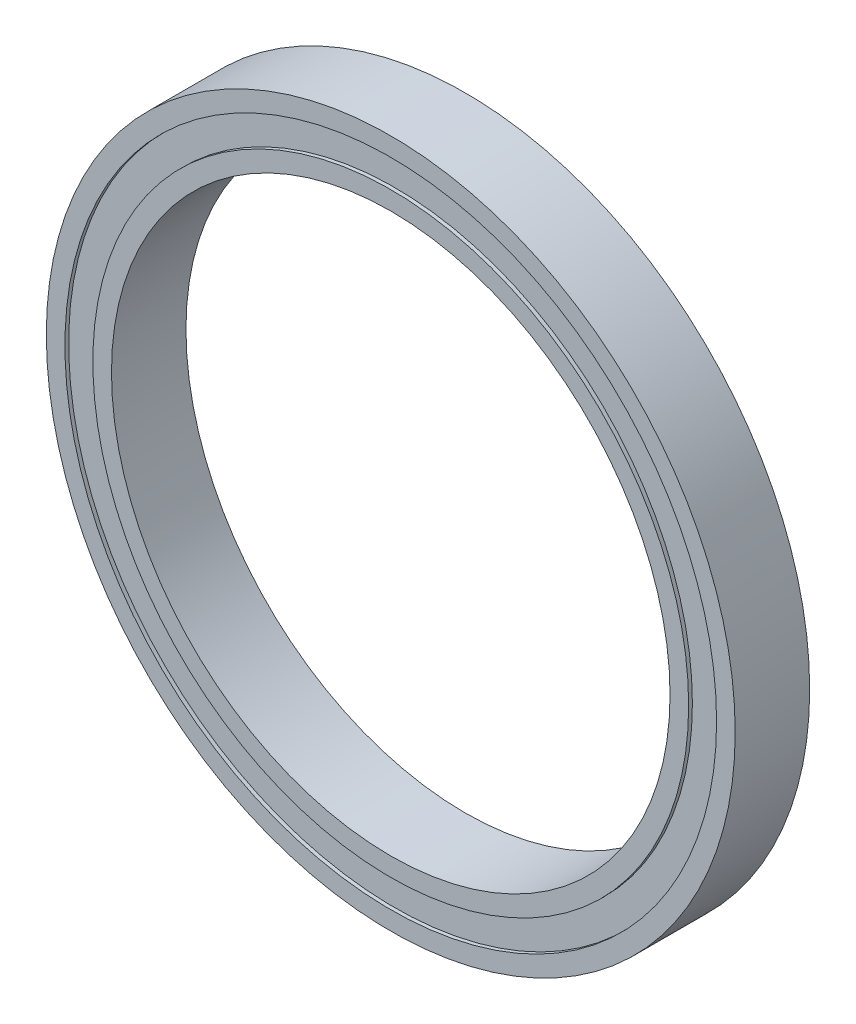
ISO-10303-21;
HEADER;
FILE_DESCRIPTION(('STEP AP214'),'2;1');
FILE_NAME('part.step','',(''),(''),'','','');
FILE_SCHEMA(('AUTOMOTIVE_DESIGN { 1 0 10303 214 1 1 1 1 }'));
ENDSEC;
DATA;
#1=APPLICATION_CONTEXT('core data for automotive mechanical design processes');
#2=APPLICATION_PROTOCOL_DEFINITION('international standard','automotive_design',2000,#1);
#3=PRODUCT_CONTEXT('',#1,'mechanical');
#4=PRODUCT('Part','Part','',(#3));
#5=PRODUCT_RELATED_PRODUCT_CATEGORY('part','',(#4));
#6=PRODUCT_DEFINITION_FORMATION('','',#4);
#7=PRODUCT_DEFINITION_CONTEXT('part definition',#1,'design');
#8=PRODUCT_DEFINITION('design','',#6,#7);
#9=PRODUCT_DEFINITION_SHAPE('','',#8);
#10=(LENGTH_UNIT() NAMED_UNIT(*) SI_UNIT(.MILLI.,.METRE.));
#11=(NAMED_UNIT(*) PLANE_ANGLE_UNIT() SI_UNIT($,.RADIAN.));
#12=(NAMED_UNIT(*) SI_UNIT($,.STERADIAN.) SOLID_ANGLE_UNIT());
#13=UNCERTAINTY_MEASURE_WITH_UNIT(LENGTH_MEASURE(1.E-05),#10,'distance_accuracy_value','');
#14=(GEOMETRIC_REPRESENTATION_CONTEXT(3) GLOBAL_UNCERTAINTY_ASSIGNED_CONTEXT((#13)) GLOBAL_UNIT_ASSIGNED_CONTEXT((#10,
#11,#12)) REPRESENTATION_CONTEXT('',''));
#15=CARTESIAN_POINT('',(0.,0.,0.));
#16=DIRECTION('',(0.,0.,1.));
#17=DIRECTION('',(1.,0.,0.));
#18=AXIS2_PLACEMENT_3D('',#15,#16,#17);
#19=CARTESIAN_POINT('',(16.,0.,-2.));
#20=DIRECTION('',(0.,0.,-1.));
#21=DIRECTION('',(-1.,0.,0.));
#22=AXIS2_PLACEMENT_3D('',#19,#20,#21);
#23=PLANE('',#22);
#24=CARTESIAN_POINT('',(0.,0.,-1.99999999999995));
#25=DIRECTION('',(0.,0.,1.));
#26=DIRECTION('',(1.,0.,0.));
#27=AXIS2_PLACEMENT_3D('',#24,#25,#26);
#28=CIRCLE('',#27,15.);
#29=CARTESIAN_POINT('',(15.,0.,-2.));
#30=VERTEX_POINT('',#29);
#31=EDGE_CURVE('E74',#30,#30,#28,.T.);
#32=ORIENTED_EDGE('',*,*,#31,.T.);
#33=EDGE_LOOP('',(#32));
#34=FACE_BOUND('',#33,.T.);
#35=CARTESIAN_POINT('',(0.,0.,-1.99999999999995));
#36=DIRECTION('',(0.,0.,1.));
#37=DIRECTION('',(1.,0.,0.));
#38=AXIS2_PLACEMENT_3D('',#35,#36,#37);
#39=CIRCLE('',#38,16.);
#40=CARTESIAN_POINT('',(16.,0.,-2.));
#41=VERTEX_POINT('',#40);
#42=EDGE_CURVE('E10',#41,#41,#39,.T.);
#43=ORIENTED_EDGE('',*,*,#42,.F.);
#44=EDGE_LOOP('',(#43));
#45=FACE_BOUND('',#44,.T.);
#46=ADVANCED_FACE('F34',(#34,#45),#23,.T.);
#47=CARTESIAN_POINT('',(1.46147243773468E-12,0.,426.054329644701));
#48=DIRECTION('',(0.,0.,1.));
#49=DIRECTION('',(1.,0.,0.));
#50=AXIS2_PLACEMENT_3D('',#47,#48,#49);
#51=CYLINDRICAL_SURFACE('',#50,16.);
#52=ORIENTED_EDGE('',*,*,#42,.T.);
#53=EDGE_LOOP('',(#52));
#54=FACE_BOUND('',#53,.T.);
#55=CARTESIAN_POINT('',(0.,0.,-1.79999999999997));
#56=DIRECTION('',(0.,0.,1.));
#57=DIRECTION('',(1.,0.,0.));
#58=AXIS2_PLACEMENT_3D('',#55,#56,#57);
#59=CIRCLE('',#58,16.);
#60=CARTESIAN_POINT('',(16.,0.,-1.80000000000002));
#61=VERTEX_POINT('',#60);
#62=EDGE_CURVE('E40',#61,#61,#59,.T.);
#63=ORIENTED_EDGE('',*,*,#62,.F.);
#64=EDGE_LOOP('',(#63));
#65=FACE_BOUND('',#64,.T.);
#66=ADVANCED_FACE('F92',(#54,#65),#51,.T.);
#67=CARTESIAN_POINT('',(16.,0.,-1.8));
#68=DIRECTION('',(0.,0.,-1.));
#69=DIRECTION('',(-1.,0.,0.));
#70=AXIS2_PLACEMENT_3D('',#67,#68,#69);
#71=PLANE('',#70);
#72=ORIENTED_EDGE('',*,*,#62,.T.);
#73=EDGE_LOOP('',(#72));
#74=FACE_BOUND('',#73,.T.);
#75=CARTESIAN_POINT('',(0.,0.,-1.79999999999997));
#76=DIRECTION('',(0.,0.,1.));
#77=DIRECTION('',(1.,0.,0.));
#78=AXIS2_PLACEMENT_3D('',#75,#76,#77);
#79=CIRCLE('',#78,17.5);
#80=CARTESIAN_POINT('',(17.5,0.,-1.80000000000003));
#81=VERTEX_POINT('',#80);
#82=EDGE_CURVE('E44',#81,#81,#79,.T.);
#83=ORIENTED_EDGE('',*,*,#82,.F.);
#84=EDGE_LOOP('',(#83));
#85=FACE_BOUND('',#84,.T.);
#86=ADVANCED_FACE('F96',(#74,#85),#71,.T.);
#87=CARTESIAN_POINT('',(1.46147243773468E-12,0.,426.054329644701));
#88=DIRECTION('',(0.,0.,1.));
#89=DIRECTION('',(1.,0.,0.));
#90=AXIS2_PLACEMENT_3D('',#87,#88,#89);
#91=CYLINDRICAL_SURFACE('',#90,17.5);
#92=ORIENTED_EDGE('',*,*,#82,.T.);
#93=EDGE_LOOP('',(#92));
#94=FACE_BOUND('',#93,.T.);
#95=CARTESIAN_POINT('',(0.,0.,-1.99999999999995));
#96=DIRECTION('',(0.,0.,1.));
#97=DIRECTION('',(1.,0.,0.));
#98=AXIS2_PLACEMENT_3D('',#95,#96,#97);
#99=CIRCLE('',#98,17.5);
#100=CARTESIAN_POINT('',(17.5,0.,-2.00000000000001));
#101=VERTEX_POINT('',#100);
#102=EDGE_CURVE('E48',#101,#101,#99,.T.);
#103=ORIENTED_EDGE('',*,*,#102,.F.);
#104=EDGE_LOOP('',(#103));
#105=FACE_BOUND('',#104,.T.);
#106=ADVANCED_FACE('F100',(#94,#105),#91,.F.);
#107=CARTESIAN_POINT('',(18.5,0.,-2.));
#108=DIRECTION('',(0.,0.,-1.));
#109=DIRECTION('',(-1.,0.,0.));
#110=AXIS2_PLACEMENT_3D('',#107,#108,#109);
#111=PLANE('',#110);
#112=ORIENTED_EDGE('',*,*,#102,.T.);
#113=EDGE_LOOP('',(#112));
#114=FACE_BOUND('',#113,.T.);
#115=CARTESIAN_POINT('',(0.,0.,-1.99999999999995));
#116=DIRECTION('',(0.,0.,1.));
#117=DIRECTION('',(1.,0.,0.));
#118=AXIS2_PLACEMENT_3D('',#115,#116,#117);
#119=CIRCLE('',#118,18.5);
#120=CARTESIAN_POINT('',(18.5,0.,-2.00000000000001));
#121=VERTEX_POINT('',#120);
#122=EDGE_CURVE('E53',#121,#121,#119,.T.);
#123=ORIENTED_EDGE('',*,*,#122,.F.);
#124=EDGE_LOOP('',(#123));
#125=FACE_BOUND('',#124,.T.);
#126=ADVANCED_FACE('F106',(#114,#125),#111,.T.);
#127=CARTESIAN_POINT('',(1.46147243773468E-12,0.,426.054329644701));
#128=DIRECTION('',(0.,0.,1.));
#129=DIRECTION('',(1.,0.,0.));
#130=AXIS2_PLACEMENT_3D('',#127,#128,#129);
#131=CYLINDRICAL_SURFACE('',#130,18.5);
#132=ORIENTED_EDGE('',*,*,#122,.T.);
#133=EDGE_LOOP('',(#132));
#134=FACE_BOUND('',#133,.T.);
#135=CARTESIAN_POINT('',(0.,0.,2.00000000000006));
#136=DIRECTION('',(0.,0.,1.));
#137=DIRECTION('',(1.,0.,0.));
#138=AXIS2_PLACEMENT_3D('',#135,#136,#137);
#139=CIRCLE('',#138,18.5);
#140=CARTESIAN_POINT('',(18.5,0.,1.99999999999999));
#141=VERTEX_POINT('',#140);
#142=EDGE_CURVE('E56',#141,#141,#139,.T.);
#143=ORIENTED_EDGE('',*,*,#142,.F.);
#144=EDGE_LOOP('',(#143));
#145=FACE_BOUND('',#144,.T.);
#146=ADVANCED_FACE('F110',(#134,#145),#131,.T.);
#147=CARTESIAN_POINT('',(18.5,0.,2.));
#148=DIRECTION('',(0.,0.,1.));
#149=DIRECTION('',(1.,0.,0.));
#150=AXIS2_PLACEMENT_3D('',#147,#148,#149);
#151=PLANE('',#150);
#152=ORIENTED_EDGE('',*,*,#142,.T.);
#153=EDGE_LOOP('',(#152));
#154=FACE_BOUND('',#153,.T.);
#155=CARTESIAN_POINT('',(0.,0.,2.00000000000006));
#156=DIRECTION('',(0.,0.,1.));
#157=DIRECTION('',(1.,0.,0.));
#158=AXIS2_PLACEMENT_3D('',#155,#156,#157);
#159=CIRCLE('',#158,17.5);
#160=CARTESIAN_POINT('',(17.5,0.,2.));
#161=VERTEX_POINT('',#160);
#162=EDGE_CURVE('E59',#161,#161,#159,.T.);
#163=ORIENTED_EDGE('',*,*,#162,.F.);
#164=EDGE_LOOP('',(#163));
#165=FACE_BOUND('',#164,.T.);
#166=ADVANCED_FACE('F114',(#154,#165),#151,.T.);
#167=CARTESIAN_POINT('',(1.46147243773468E-12,0.,426.054329644701));
#168=DIRECTION('',(0.,0.,1.));
#169=DIRECTION('',(1.,0.,0.));
#170=AXIS2_PLACEMENT_3D('',#167,#168,#169);
#171=CYLINDRICAL_SURFACE('',#170,17.5);
#172=ORIENTED_EDGE('',*,*,#162,.T.);
#173=EDGE_LOOP('',(#172));
#174=FACE_BOUND('',#173,.T.);
#175=CARTESIAN_POINT('',(0.,0.,1.80000000000008));
#176=DIRECTION('',(0.,0.,1.));
#177=DIRECTION('',(1.,0.,0.));
#178=AXIS2_PLACEMENT_3D('',#175,#176,#177);
#179=CIRCLE('',#178,17.5);
#180=CARTESIAN_POINT('',(17.5,0.,1.80000000000002));
#181=VERTEX_POINT('',#180);
#182=EDGE_CURVE('E62',#181,#181,#179,.T.);
#183=ORIENTED_EDGE('',*,*,#182,.F.);
#184=EDGE_LOOP('',(#183));
#185=FACE_BOUND('',#184,.T.);
#186=ADVANCED_FACE('F118',(#174,#185),#171,.F.);
#187=CARTESIAN_POINT('',(16.,0.,1.8));
#188=DIRECTION('',(0.,0.,1.));
#189=DIRECTION('',(1.,0.,0.));
#190=AXIS2_PLACEMENT_3D('',#187,#188,#189);
#191=PLANE('',#190);
#192=ORIENTED_EDGE('',*,*,#182,.T.);
#193=EDGE_LOOP('',(#192));
#194=FACE_BOUND('',#193,.T.);
#195=CARTESIAN_POINT('',(0.,0.,1.80000000000008));
#196=DIRECTION('',(0.,0.,1.));
#197=DIRECTION('',(1.,0.,0.));
#198=AXIS2_PLACEMENT_3D('',#195,#196,#197);
#199=CIRCLE('',#198,16.);
#200=CARTESIAN_POINT('',(16.,0.,1.80000000000002));
#201=VERTEX_POINT('',#200);
#202=EDGE_CURVE('E65',#201,#201,#199,.T.);
#203=ORIENTED_EDGE('',*,*,#202,.F.);
#204=EDGE_LOOP('',(#203));
#205=FACE_BOUND('',#204,.T.);
#206=ADVANCED_FACE('F122',(#194,#205),#191,.T.);
#207=CARTESIAN_POINT('',(1.46147243773468E-12,0.,426.054329644701));
#208=DIRECTION('',(0.,0.,1.));
#209=DIRECTION('',(1.,0.,0.));
#210=AXIS2_PLACEMENT_3D('',#207,#208,#209);
#211=CYLINDRICAL_SURFACE('',#210,16.);
#212=ORIENTED_EDGE('',*,*,#202,.T.);
#213=EDGE_LOOP('',(#212));
#214=FACE_BOUND('',#213,.T.);
#215=CARTESIAN_POINT('',(0.,0.,2.00000000000006));
#216=DIRECTION('',(0.,0.,1.));
#217=DIRECTION('',(1.,0.,0.));
#218=AXIS2_PLACEMENT_3D('',#215,#216,#217);
#219=CIRCLE('',#218,16.);
#220=CARTESIAN_POINT('',(16.,0.,2.));
#221=VERTEX_POINT('',#220);
#222=EDGE_CURVE('E68',#221,#221,#219,.T.);
#223=ORIENTED_EDGE('',*,*,#222,.F.);
#224=EDGE_LOOP('',(#223));
#225=FACE_BOUND('',#224,.T.);
#226=ADVANCED_FACE('F88',(#214,#225),#211,.T.);
#227=CARTESIAN_POINT('',(16.,0.,2.));
#228=DIRECTION('',(0.,0.,1.));
#229=DIRECTION('',(1.,0.,0.));
#230=AXIS2_PLACEMENT_3D('',#227,#228,#229);
#231=PLANE('',#230);
#232=ORIENTED_EDGE('',*,*,#222,.T.);
#233=EDGE_LOOP('',(#232));
#234=FACE_BOUND('',#233,.T.);
#235=CARTESIAN_POINT('',(0.,0.,2.00000000000006));
#236=DIRECTION('',(0.,0.,1.));
#237=DIRECTION('',(1.,0.,0.));
#238=AXIS2_PLACEMENT_3D('',#235,#236,#237);
#239=CIRCLE('',#238,15.);
#240=CARTESIAN_POINT('',(15.,0.,2.00000000000001));
#241=VERTEX_POINT('',#240);
#242=EDGE_CURVE('E71',#241,#241,#239,.T.);
#243=ORIENTED_EDGE('',*,*,#242,.F.);
#244=EDGE_LOOP('',(#243));
#245=FACE_BOUND('',#244,.T.);
#246=ADVANCED_FACE('F82',(#234,#245),#231,.T.);
#247=CARTESIAN_POINT('',(1.46147243773468E-12,0.,426.054329644701));
#248=DIRECTION('',(0.,0.,1.));
#249=DIRECTION('',(1.,0.,0.));
#250=AXIS2_PLACEMENT_3D('',#247,#248,#249);
#251=CYLINDRICAL_SURFACE('',#250,15.);
#252=ORIENTED_EDGE('',*,*,#242,.T.);
#253=EDGE_LOOP('',(#252));
#254=FACE_BOUND('',#253,.T.);
#255=ORIENTED_EDGE('',*,*,#31,.F.);
#256=EDGE_LOOP('',(#255));
#257=FACE_BOUND('',#256,.T.);
#258=ADVANCED_FACE('F80',(#254,#257),#251,.F.);
#259=CLOSED_SHELL('',(#46,#66,#86,#106,#126,#146,#166,#186,#206,#226,#246,#258));
#260=MANIFOLD_SOLID_BREP('B2',#259);
#261=ADVANCED_BREP_SHAPE_REPRESENTATION('',(#18,#260),#14);
#262=SHAPE_DEFINITION_REPRESENTATION(#9,#261);
ENDSEC;
END-ISO-10303-21;
